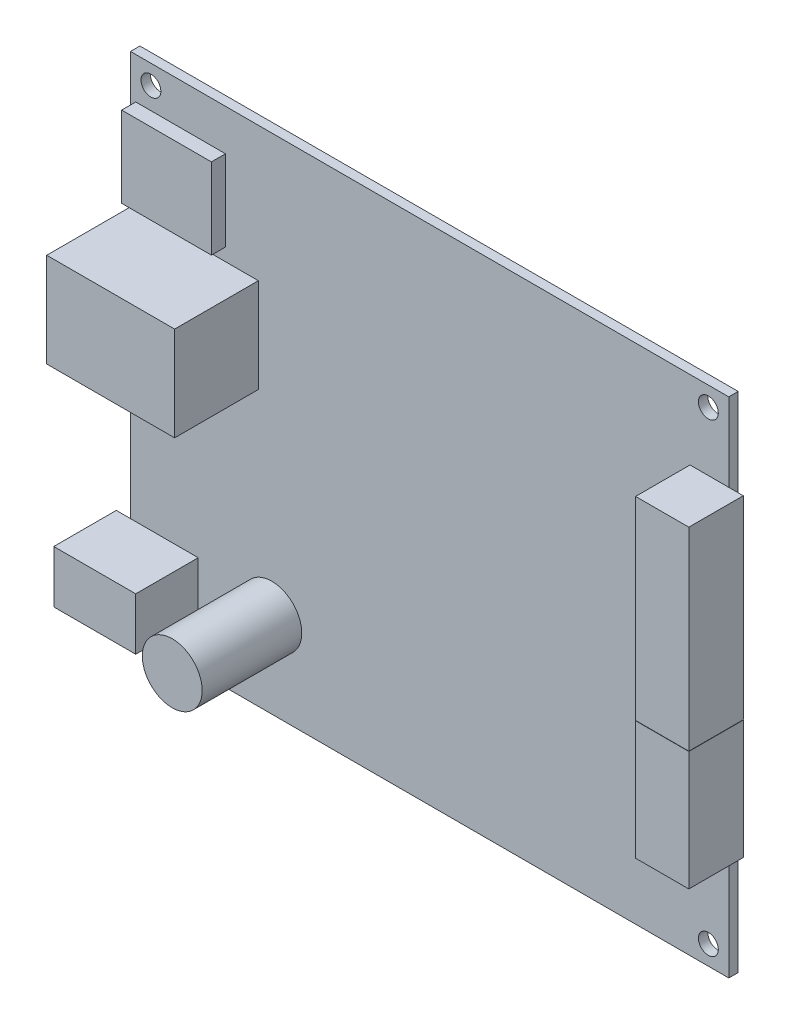
ISO-10303-21;
HEADER;
FILE_DESCRIPTION(('STEP AP214'),'2;1');
FILE_NAME('part.step','',(''),(''),'','','');
FILE_SCHEMA(('AUTOMOTIVE_DESIGN { 1 0 10303 214 1 1 1 1 }'));
ENDSEC;
DATA;
#1=APPLICATION_CONTEXT('core data for automotive mechanical design processes');
#2=APPLICATION_PROTOCOL_DEFINITION('international standard','automotive_design',2000,#1);
#3=PRODUCT_CONTEXT('',#1,'mechanical');
#4=PRODUCT('Part','Part','',(#3));
#5=PRODUCT_RELATED_PRODUCT_CATEGORY('part','',(#4));
#6=PRODUCT_DEFINITION_FORMATION('','',#4);
#7=PRODUCT_DEFINITION_CONTEXT('part definition',#1,'design');
#8=PRODUCT_DEFINITION('design','',#6,#7);
#9=PRODUCT_DEFINITION_SHAPE('','',#8);
#10=(LENGTH_UNIT() NAMED_UNIT(*) SI_UNIT(.MILLI.,.METRE.));
#11=(NAMED_UNIT(*) PLANE_ANGLE_UNIT() SI_UNIT($,.RADIAN.));
#12=(NAMED_UNIT(*) SI_UNIT($,.STERADIAN.) SOLID_ANGLE_UNIT());
#13=UNCERTAINTY_MEASURE_WITH_UNIT(LENGTH_MEASURE(1.E-05),#10,'distance_accuracy_value','');
#14=(GEOMETRIC_REPRESENTATION_CONTEXT(3) GLOBAL_UNCERTAINTY_ASSIGNED_CONTEXT((#13)) GLOBAL_UNIT_ASSIGNED_CONTEXT((#10,
#11,#12)) REPRESENTATION_CONTEXT('',''));
#15=CARTESIAN_POINT('',(0.,0.,0.));
#16=DIRECTION('',(0.,0.,1.));
#17=DIRECTION('',(1.,0.,0.));
#18=AXIS2_PLACEMENT_3D('',#15,#16,#17);
#19=CARTESIAN_POINT('',(0.,0.,1.6002));
#20=DIRECTION('',(0.,0.,-1.));
#21=DIRECTION('',(-1.,0.,0.));
#22=AXIS2_PLACEMENT_3D('',#19,#20,#21);
#23=PLANE('',#22);
#24=CARTESIAN_POINT('',(-47.3329,39.4462,1.6002));
#25=DIRECTION('',(0.,0.,-1.));
#26=DIRECTION('',(-1.,0.,0.));
#27=AXIS2_PLACEMENT_3D('',#24,#25,#26);
#28=CIRCLE('',#27,1.6891);
#29=CARTESIAN_POINT('',(-49.022,39.4462,1.6002));
#30=VERTEX_POINT('',#29);
#31=EDGE_CURVE('E775',#30,#30,#28,.F.);
#32=ORIENTED_EDGE('',*,*,#31,.F.);
#33=EDGE_LOOP('',(#32));
#34=FACE_BOUND('',#33,.T.);
#35=CARTESIAN_POINT('',(47.3329,39.4462,1.6002));
#36=DIRECTION('',(0.,0.,-1.));
#37=DIRECTION('',(-1.,0.,0.));
#38=AXIS2_PLACEMENT_3D('',#35,#36,#37);
#39=CIRCLE('',#38,1.6891);
#40=CARTESIAN_POINT('',(45.6438,39.4462,1.6002));
#41=VERTEX_POINT('',#40);
#42=EDGE_CURVE('E781',#41,#41,#39,.T.);
#43=ORIENTED_EDGE('',*,*,#42,.T.);
#44=EDGE_LOOP('',(#43));
#45=FACE_BOUND('',#44,.T.);
#46=DIRECTION('',(0.,-1.,0.));
#47=VECTOR('',#46,1.);
#48=CARTESIAN_POINT('',(-49.911,22.0345,1.6002));
#49=LINE('',#48,#47);
#50=CARTESIAN_POINT('',(-49.911,35.7505,1.6002));
#51=VERTEX_POINT('',#50);
#52=CARTESIAN_POINT('',(-49.911,22.0345,1.6002));
#53=VERTEX_POINT('',#52);
#54=EDGE_CURVE('E234',#51,#53,#49,.T.);
#55=ORIENTED_EDGE('',*,*,#54,.F.);
#56=DIRECTION('',(-1.,0.,0.));
#57=VECTOR('',#56,1.);
#58=CARTESIAN_POINT('',(-49.911,35.7505,1.6002));
#59=LINE('',#58,#57);
#60=CARTESIAN_POINT('',(-34.671,35.7505,1.6002));
#61=VERTEX_POINT('',#60);
#62=EDGE_CURVE('E231',#61,#51,#59,.T.);
#63=ORIENTED_EDGE('',*,*,#62,.F.);
#64=DIRECTION('',(0.,1.,0.));
#65=VECTOR('',#64,1.);
#66=CARTESIAN_POINT('',(-34.671,22.0345,1.6002));
#67=LINE('',#66,#65);
#68=CARTESIAN_POINT('',(-34.671,22.0345,1.6002));
#69=VERTEX_POINT('',#68);
#70=EDGE_CURVE('E55',#69,#61,#67,.T.);
#71=ORIENTED_EDGE('',*,*,#70,.F.);
#72=DIRECTION('',(1.,0.,0.));
#73=VECTOR('',#72,1.);
#74=CARTESIAN_POINT('',(-49.911,22.0345,1.6002));
#75=LINE('',#74,#73);
#76=EDGE_CURVE('E50',#53,#69,#75,.T.);
#77=ORIENTED_EDGE('',*,*,#76,.F.);
#78=EDGE_LOOP('',(#55,#63,#71,#77));
#79=FACE_BOUND('',#78,.T.);
#80=DIRECTION('',(-1.,0.,0.));
#81=VECTOR('',#80,1.);
#82=CARTESIAN_POINT('',(53.2638,-3.5687,1.6002));
#83=LINE('',#82,#81);
#84=CARTESIAN_POINT('',(50.8,-3.5687,1.6002));
#85=VERTEX_POINT('',#84);
#86=CARTESIAN_POINT('',(44.2214,-3.5687,1.6002));
#87=VERTEX_POINT('',#86);
#88=EDGE_CURVE('E238',#85,#87,#83,.T.);
#89=ORIENTED_EDGE('',*,*,#88,.F.);
#90=DIRECTION('',(0.,1.,0.));
#91=VECTOR('',#90,1.);
#92=CARTESIAN_POINT('',(50.8,-42.7355,1.6002));
#93=LINE('',#92,#91);
#94=CARTESIAN_POINT('',(50.8,-3.5179,1.6002));
#95=VERTEX_POINT('',#94);
#96=EDGE_CURVE('E522',#85,#95,#93,.T.);
#97=ORIENTED_EDGE('',*,*,#96,.T.);
#98=DIRECTION('',(1.,0.,0.));
#99=VECTOR('',#98,1.);
#100=CARTESIAN_POINT('',(53.2638,-3.5179,1.6002));
#101=LINE('',#100,#99);
#102=CARTESIAN_POINT('',(44.2214,-3.5179,1.6002));
#103=VERTEX_POINT('',#102);
#104=EDGE_CURVE('E280',#103,#95,#101,.T.);
#105=ORIENTED_EDGE('',*,*,#104,.F.);
#106=DIRECTION('',(0.,-1.,0.));
#107=VECTOR('',#106,1.);
#108=CARTESIAN_POINT('',(44.2214,29.4259,1.6002));
#109=LINE('',#108,#107);
#110=CARTESIAN_POINT('',(44.2214,29.4259,1.6002));
#111=VERTEX_POINT('',#110);
#112=EDGE_CURVE('E293',#111,#103,#109,.T.);
#113=ORIENTED_EDGE('',*,*,#112,.F.);
#114=DIRECTION('',(-1.,0.,0.));
#115=VECTOR('',#114,1.);
#116=CARTESIAN_POINT('',(53.2638,29.4259,1.6002));
#117=LINE('',#116,#115);
#118=CARTESIAN_POINT('',(50.8,29.4259,1.6002));
#119=VERTEX_POINT('',#118);
#120=EDGE_CURVE('E289',#119,#111,#117,.T.);
#121=ORIENTED_EDGE('',*,*,#120,.F.);
#122=CARTESIAN_POINT('',(50.8,42.7355,1.6002));
#123=VERTEX_POINT('',#122);
#124=EDGE_CURVE('E407',#119,#123,#93,.T.);
#125=ORIENTED_EDGE('',*,*,#124,.T.);
#126=DIRECTION('',(-1.,0.,0.));
#127=VECTOR('',#126,1.);
#128=CARTESIAN_POINT('',(-50.8,42.7355,1.6002));
#129=LINE('',#128,#127);
#130=CARTESIAN_POINT('',(-50.8,42.7355,1.6002));
#131=VERTEX_POINT('',#130);
#132=EDGE_CURVE('E382',#123,#131,#129,.T.);
#133=ORIENTED_EDGE('',*,*,#132,.T.);
#134=DIRECTION('',(0.,-1.,0.));
#135=VECTOR('',#134,1.);
#136=CARTESIAN_POINT('',(-50.8,-42.7355,1.6002));
#137=LINE('',#136,#135);
#138=CARTESIAN_POINT('',(-50.8,19.8755,1.6002));
#139=VERTEX_POINT('',#138);
#140=EDGE_CURVE('E392',#131,#139,#137,.T.);
#141=ORIENTED_EDGE('',*,*,#140,.T.);
#142=DIRECTION('',(-1.,0.,0.));
#143=VECTOR('',#142,1.);
#144=CARTESIAN_POINT('',(-50.8,19.8755,1.6002));
#145=LINE('',#144,#143);
#146=CARTESIAN_POINT('',(-29.083,19.8755,1.6002));
#147=VERTEX_POINT('',#146);
#148=EDGE_CURVE('E350',#147,#139,#145,.T.);
#149=ORIENTED_EDGE('',*,*,#148,.F.);
#150=DIRECTION('',(0.,1.,0.));
#151=VECTOR('',#150,1.);
#152=CARTESIAN_POINT('',(-29.083,3.8735,1.6002));
#153=LINE('',#152,#151);
#154=CARTESIAN_POINT('',(-29.083,3.8735,1.6002));
#155=VERTEX_POINT('',#154);
#156=EDGE_CURVE('E357',#155,#147,#153,.T.);
#157=ORIENTED_EDGE('',*,*,#156,.F.);
#158=DIRECTION('',(1.,0.,0.));
#159=VECTOR('',#158,1.);
#160=CARTESIAN_POINT('',(-50.8,3.8735,1.6002));
#161=LINE('',#160,#159);
#162=CARTESIAN_POINT('',(-50.8,3.8735,1.6002));
#163=VERTEX_POINT('',#162);
#164=EDGE_CURVE('E345',#163,#155,#161,.T.);
#165=ORIENTED_EDGE('',*,*,#164,.F.);
#166=CARTESIAN_POINT('',(-50.8,-25.9715,1.6002));
#167=VERTEX_POINT('',#166);
#168=EDGE_CURVE('E377',#163,#167,#137,.T.);
#169=ORIENTED_EDGE('',*,*,#168,.T.);
#170=DIRECTION('',(-1.,0.,0.));
#171=VECTOR('',#170,1.);
#172=CARTESIAN_POINT('',(-53.213,-25.9715,1.6002));
#173=LINE('',#172,#171);
#174=CARTESIAN_POINT('',(-39.2938,-25.9715,1.6002));
#175=VERTEX_POINT('',#174);
#176=EDGE_CURVE('E315',#175,#167,#173,.T.);
#177=ORIENTED_EDGE('',*,*,#176,.F.);
#178=DIRECTION('',(0.,1.,0.));
#179=VECTOR('',#178,1.);
#180=CARTESIAN_POINT('',(-39.2938,-34.8615,1.6002));
#181=LINE('',#180,#179);
#182=CARTESIAN_POINT('',(-39.2938,-34.8615,1.6002));
#183=VERTEX_POINT('',#182);
#184=EDGE_CURVE('E328',#183,#175,#181,.T.);
#185=ORIENTED_EDGE('',*,*,#184,.F.);
#186=DIRECTION('',(1.,0.,0.));
#187=VECTOR('',#186,1.);
#188=CARTESIAN_POINT('',(-53.213,-34.8615,1.6002));
#189=LINE('',#188,#187);
#190=CARTESIAN_POINT('',(-50.8,-34.8615,1.6002));
#191=VERTEX_POINT('',#190);
#192=EDGE_CURVE('E324',#191,#183,#189,.T.);
#193=ORIENTED_EDGE('',*,*,#192,.F.);
#194=CARTESIAN_POINT('',(-50.8,-42.7355,1.6002));
#195=VERTEX_POINT('',#194);
#196=EDGE_CURVE('E378',#191,#195,#137,.T.);
#197=ORIENTED_EDGE('',*,*,#196,.T.);
#198=DIRECTION('',(1.,0.,0.));
#199=VECTOR('',#198,1.);
#200=CARTESIAN_POINT('',(-50.8,-42.7355,1.6002));
#201=LINE('',#200,#199);
#202=CARTESIAN_POINT('',(50.8,-42.7355,1.6002));
#203=VERTEX_POINT('',#202);
#204=EDGE_CURVE('E384',#195,#203,#201,.T.);
#205=ORIENTED_EDGE('',*,*,#204,.T.);
#206=CARTESIAN_POINT('',(50.8,-23.7871,1.6002));
#207=VERTEX_POINT('',#206);
#208=EDGE_CURVE('E518',#203,#207,#93,.T.);
#209=ORIENTED_EDGE('',*,*,#208,.T.);
#210=DIRECTION('',(1.,0.,0.));
#211=VECTOR('',#210,1.);
#212=CARTESIAN_POINT('',(53.2638,-23.7871,1.6002));
#213=LINE('',#212,#211);
#214=CARTESIAN_POINT('',(44.2214,-23.7871,1.6002));
#215=VERTEX_POINT('',#214);
#216=EDGE_CURVE('E248',#215,#207,#213,.T.);
#217=ORIENTED_EDGE('',*,*,#216,.F.);
#218=DIRECTION('',(0.,-1.,0.));
#219=VECTOR('',#218,1.);
#220=CARTESIAN_POINT('',(44.2214,-3.5687,1.6002));
#221=LINE('',#220,#219);
#222=EDGE_CURVE('E258',#87,#215,#221,.T.);
#223=ORIENTED_EDGE('',*,*,#222,.F.);
#224=EDGE_LOOP('',(#89,#97,#105,#113,#121,#125,#133,#141,#149,#157,#165,#169,#177,#185,#193,
#197,#205,#209,#217,#223));
#225=FACE_BOUND('',#224,.T.);
#226=CARTESIAN_POINT('',(-26.797,-28.2575,1.6002));
#227=DIRECTION('',(0.,0.,-1.));
#228=DIRECTION('',(-1.,0.,0.));
#229=AXIS2_PLACEMENT_3D('',#226,#227,#228);
#230=CIRCLE('',#229,5.08);
#231=CARTESIAN_POINT('',(-31.877,-28.2575,1.6002));
#232=VERTEX_POINT('',#231);
#233=EDGE_CURVE('E11',#232,#232,#230,.F.);
#234=ORIENTED_EDGE('',*,*,#233,.F.);
#235=EDGE_LOOP('',(#234));
#236=FACE_BOUND('',#235,.T.);
#237=CARTESIAN_POINT('',(-47.3329,-39.4462,1.6002));
#238=DIRECTION('',(0.,0.,-1.));
#239=DIRECTION('',(-1.,0.,0.));
#240=AXIS2_PLACEMENT_3D('',#237,#238,#239);
#241=CIRCLE('',#240,1.6891);
#242=CARTESIAN_POINT('',(-49.022,-39.4462,1.6002));
#243=VERTEX_POINT('',#242);
#244=EDGE_CURVE('E766',#243,#243,#241,.T.);
#245=ORIENTED_EDGE('',*,*,#244,.T.);
#246=EDGE_LOOP('',(#245));
#247=FACE_BOUND('',#246,.T.);
#248=CARTESIAN_POINT('',(47.3329,-39.4462,1.6002));
#249=DIRECTION('',(0.,0.,-1.));
#250=DIRECTION('',(-1.,0.,0.));
#251=AXIS2_PLACEMENT_3D('',#248,#249,#250);
#252=CIRCLE('',#251,1.6891);
#253=CARTESIAN_POINT('',(45.6438,-39.4462,1.6002));
#254=VERTEX_POINT('',#253);
#255=EDGE_CURVE('E761',#254,#254,#252,.F.);
#256=ORIENTED_EDGE('',*,*,#255,.F.);
#257=EDGE_LOOP('',(#256));
#258=FACE_BOUND('',#257,.T.);
#259=ADVANCED_FACE('F35',(#34,#45,#79,#225,#236,#247,#258),#23,.F.);
#260=CARTESIAN_POINT('',(0.,0.,0.));
#261=DIRECTION('',(0.,0.,-1.));
#262=DIRECTION('',(-1.,0.,0.));
#263=AXIS2_PLACEMENT_3D('',#260,#261,#262);
#264=PLANE('',#263);
#265=CARTESIAN_POINT('',(-47.3329,39.4462,0.));
#266=DIRECTION('',(0.,0.,1.));
#267=DIRECTION('',(1.,0.,0.));
#268=AXIS2_PLACEMENT_3D('',#265,#266,#267);
#269=CIRCLE('',#268,1.6891);
#270=CARTESIAN_POINT('',(-45.6438,39.4462,0.));
#271=VERTEX_POINT('',#270);
#272=EDGE_CURVE('E772',#271,#271,#269,.T.);
#273=ORIENTED_EDGE('',*,*,#272,.T.);
#274=EDGE_LOOP('',(#273));
#275=FACE_BOUND('',#274,.T.);
#276=CARTESIAN_POINT('',(47.3329,39.4462,0.));
#277=DIRECTION('',(0.,0.,-1.));
#278=DIRECTION('',(-1.,0.,0.));
#279=AXIS2_PLACEMENT_3D('',#276,#277,#278);
#280=CIRCLE('',#279,1.6891);
#281=CARTESIAN_POINT('',(45.6438,39.4462,0.));
#282=VERTEX_POINT('',#281);
#283=EDGE_CURVE('E778',#282,#282,#280,.T.);
#284=ORIENTED_EDGE('',*,*,#283,.F.);
#285=EDGE_LOOP('',(#284));
#286=FACE_BOUND('',#285,.T.);
#287=DIRECTION('',(0.,1.,0.));
#288=VECTOR('',#287,1.);
#289=CARTESIAN_POINT('',(50.8,-42.7355,0.));
#290=LINE('',#289,#288);
#291=CARTESIAN_POINT('',(50.8,-42.7355,0.));
#292=VERTEX_POINT('',#291);
#293=CARTESIAN_POINT('',(50.8,42.7355,0.));
#294=VERTEX_POINT('',#293);
#295=EDGE_CURVE('E411',#292,#294,#290,.T.);
#296=ORIENTED_EDGE('',*,*,#295,.F.);
#297=DIRECTION('',(1.,0.,0.));
#298=VECTOR('',#297,1.);
#299=CARTESIAN_POINT('',(-50.8,-42.7355,0.));
#300=LINE('',#299,#298);
#301=CARTESIAN_POINT('',(-50.8,-42.7355,0.));
#302=VERTEX_POINT('',#301);
#303=EDGE_CURVE('E405',#302,#292,#300,.T.);
#304=ORIENTED_EDGE('',*,*,#303,.F.);
#305=DIRECTION('',(0.,-1.,0.));
#306=VECTOR('',#305,1.);
#307=CARTESIAN_POINT('',(-50.8,-42.7355,0.));
#308=LINE('',#307,#306);
#309=CARTESIAN_POINT('',(-50.8,42.7355,0.));
#310=VERTEX_POINT('',#309);
#311=EDGE_CURVE('E408',#310,#302,#308,.T.);
#312=ORIENTED_EDGE('',*,*,#311,.F.);
#313=DIRECTION('',(-1.,0.,0.));
#314=VECTOR('',#313,1.);
#315=CARTESIAN_POINT('',(-50.8,42.7355,0.));
#316=LINE('',#315,#314);
#317=EDGE_CURVE('E410',#294,#310,#316,.T.);
#318=ORIENTED_EDGE('',*,*,#317,.F.);
#319=EDGE_LOOP('',(#296,#304,#312,#318));
#320=FACE_BOUND('',#319,.T.);
#321=CARTESIAN_POINT('',(-47.3329,-39.4462,0.));
#322=DIRECTION('',(0.,0.,-1.));
#323=DIRECTION('',(1.,0.,0.));
#324=AXIS2_PLACEMENT_3D('',#321,#322,#323);
#325=CIRCLE('',#324,1.6891);
#326=CARTESIAN_POINT('',(-45.6438,-39.4462,0.));
#327=VERTEX_POINT('',#326);
#328=EDGE_CURVE('E763',#327,#327,#325,.T.);
#329=ORIENTED_EDGE('',*,*,#328,.F.);
#330=EDGE_LOOP('',(#329));
#331=FACE_BOUND('',#330,.T.);
#332=CARTESIAN_POINT('',(47.3329,-39.4462,0.));
#333=DIRECTION('',(0.,0.,1.));
#334=DIRECTION('',(-1.,0.,0.));
#335=AXIS2_PLACEMENT_3D('',#332,#333,#334);
#336=CIRCLE('',#335,1.6891);
#337=CARTESIAN_POINT('',(45.6438,-39.4462,0.));
#338=VERTEX_POINT('',#337);
#339=EDGE_CURVE('E758',#338,#338,#336,.T.);
#340=ORIENTED_EDGE('',*,*,#339,.T.);
#341=EDGE_LOOP('',(#340));
#342=FACE_BOUND('',#341,.T.);
#343=ADVANCED_FACE('F481',(#275,#286,#320,#331,#342),#264,.T.);
#344=CARTESIAN_POINT('',(50.8,-42.7355,1.6002));
#345=DIRECTION('',(-1.,0.,0.));
#346=DIRECTION('',(0.,0.,1.));
#347=AXIS2_PLACEMENT_3D('',#344,#345,#346);
#348=PLANE('',#347);
#349=ORIENTED_EDGE('',*,*,#295,.T.);
#350=DIRECTION('',(0.,0.,-1.));
#351=VECTOR('',#350,1.);
#352=CARTESIAN_POINT('',(50.8,42.7355,1.6002));
#353=LINE('',#352,#351);
#354=EDGE_CURVE('E43',#123,#294,#353,.T.);
#355=ORIENTED_EDGE('',*,*,#354,.F.);
#356=ORIENTED_EDGE('',*,*,#124,.F.);
#357=EDGE_CURVE('E523',#95,#119,#93,.T.);
#358=ORIENTED_EDGE('',*,*,#357,.F.);
#359=ORIENTED_EDGE('',*,*,#96,.F.);
#360=EDGE_CURVE('E520',#207,#85,#93,.T.);
#361=ORIENTED_EDGE('',*,*,#360,.F.);
#362=ORIENTED_EDGE('',*,*,#208,.F.);
#363=DIRECTION('',(0.,0.,-1.));
#364=VECTOR('',#363,1.);
#365=CARTESIAN_POINT('',(50.8,-42.7355,1.6002));
#366=LINE('',#365,#364);
#367=EDGE_CURVE('E402',#203,#292,#366,.T.);
#368=ORIENTED_EDGE('',*,*,#367,.T.);
#369=EDGE_LOOP('',(#349,#355,#356,#358,#359,#361,#362,#368));
#370=FACE_BOUND('',#369,.T.);
#371=ADVANCED_FACE('F37',(#370),#348,.F.);
#372=CARTESIAN_POINT('',(-50.8,42.7355,1.6002));
#373=DIRECTION('',(0.,-1.,0.));
#374=DIRECTION('',(0.,0.,-1.));
#375=AXIS2_PLACEMENT_3D('',#372,#373,#374);
#376=PLANE('',#375);
#377=ORIENTED_EDGE('',*,*,#317,.T.);
#378=DIRECTION('',(0.,0.,-1.));
#379=VECTOR('',#378,1.);
#380=CARTESIAN_POINT('',(-50.8,42.7355,1.6002));
#381=LINE('',#380,#379);
#382=EDGE_CURVE('E396',#131,#310,#381,.T.);
#383=ORIENTED_EDGE('',*,*,#382,.F.);
#384=ORIENTED_EDGE('',*,*,#132,.F.);
#385=ORIENTED_EDGE('',*,*,#354,.T.);
#386=EDGE_LOOP('',(#377,#383,#384,#385));
#387=FACE_BOUND('',#386,.T.);
#388=ADVANCED_FACE('F500',(#387),#376,.F.);
#389=CARTESIAN_POINT('',(-50.8,-42.7355,1.6002));
#390=DIRECTION('',(1.,0.,0.));
#391=DIRECTION('',(0.,0.,-1.));
#392=AXIS2_PLACEMENT_3D('',#389,#390,#391);
#393=PLANE('',#392);
#394=ORIENTED_EDGE('',*,*,#311,.T.);
#395=DIRECTION('',(0.,0.,-1.));
#396=VECTOR('',#395,1.);
#397=CARTESIAN_POINT('',(-50.8,-42.7355,1.6002));
#398=LINE('',#397,#396);
#399=EDGE_CURVE('E399',#195,#302,#398,.T.);
#400=ORIENTED_EDGE('',*,*,#399,.F.);
#401=ORIENTED_EDGE('',*,*,#196,.F.);
#402=EDGE_CURVE('E374',#167,#191,#137,.T.);
#403=ORIENTED_EDGE('',*,*,#402,.F.);
#404=ORIENTED_EDGE('',*,*,#168,.F.);
#405=DIRECTION('',(0.,0.,-1.));
#406=VECTOR('',#405,1.);
#407=CARTESIAN_POINT('',(-50.8,3.8735,15.8242));
#408=LINE('',#407,#406);
#409=CARTESIAN_POINT('',(-50.8,3.8735,15.8242));
#410=VERTEX_POINT('',#409);
#411=EDGE_CURVE('E413',#410,#163,#408,.T.);
#412=ORIENTED_EDGE('',*,*,#411,.F.);
#413=DIRECTION('',(0.,-1.,0.));
#414=VECTOR('',#413,1.);
#415=CARTESIAN_POINT('',(-50.8,3.8735,15.8242));
#416=LINE('',#415,#414);
#417=CARTESIAN_POINT('',(-50.8,19.8755,15.8242));
#418=VERTEX_POINT('',#417);
#419=EDGE_CURVE('E346',#418,#410,#416,.T.);
#420=ORIENTED_EDGE('',*,*,#419,.F.);
#421=DIRECTION('',(0.,0.,-1.));
#422=VECTOR('',#421,1.);
#423=CARTESIAN_POINT('',(-50.8,19.8755,15.8242));
#424=LINE('',#423,#422);
#425=EDGE_CURVE('E356',#418,#139,#424,.T.);
#426=ORIENTED_EDGE('',*,*,#425,.T.);
#427=ORIENTED_EDGE('',*,*,#140,.F.);
#428=ORIENTED_EDGE('',*,*,#382,.T.);
#429=EDGE_LOOP('',(#394,#400,#401,#403,#404,#412,#420,#426,#427,#428));
#430=FACE_BOUND('',#429,.T.);
#431=ADVANCED_FACE('F441',(#430),#393,.F.);
#432=CARTESIAN_POINT('',(-50.8,-42.7355,1.6002));
#433=DIRECTION('',(0.,1.,0.));
#434=DIRECTION('',(0.,0.,1.));
#435=AXIS2_PLACEMENT_3D('',#432,#433,#434);
#436=PLANE('',#435);
#437=ORIENTED_EDGE('',*,*,#303,.T.);
#438=ORIENTED_EDGE('',*,*,#367,.F.);
#439=ORIENTED_EDGE('',*,*,#204,.F.);
#440=ORIENTED_EDGE('',*,*,#399,.T.);
#441=EDGE_LOOP('',(#437,#438,#439,#440));
#442=FACE_BOUND('',#441,.T.);
#443=ADVANCED_FACE('F495',(#442),#436,.F.);
#444=CARTESIAN_POINT('',(-50.8,3.8735,15.8242));
#445=DIRECTION('',(0.,1.,0.));
#446=DIRECTION('',(-1.,0.,0.));
#447=AXIS2_PLACEMENT_3D('',#444,#445,#446);
#448=PLANE('',#447);
#449=ORIENTED_EDGE('',*,*,#164,.T.);
#450=DIRECTION('',(0.,0.,-1.));
#451=VECTOR('',#450,1.);
#452=CARTESIAN_POINT('',(-29.083,3.8735,15.8242));
#453=LINE('',#452,#451);
#454=CARTESIAN_POINT('',(-29.083,3.8735,15.8242));
#455=VERTEX_POINT('',#454);
#456=EDGE_CURVE('E418',#455,#155,#453,.T.);
#457=ORIENTED_EDGE('',*,*,#456,.F.);
#458=DIRECTION('',(1.,0.,0.));
#459=VECTOR('',#458,1.);
#460=CARTESIAN_POINT('',(-50.8,3.8735,15.8242));
#461=LINE('',#460,#459);
#462=EDGE_CURVE('E349',#410,#455,#461,.T.);
#463=ORIENTED_EDGE('',*,*,#462,.F.);
#464=ORIENTED_EDGE('',*,*,#411,.T.);
#465=EDGE_LOOP('',(#449,#457,#463,#464));
#466=FACE_BOUND('',#465,.T.);
#467=ADVANCED_FACE('F426',(#466),#448,.F.);
#468=CARTESIAN_POINT('',(-29.083,3.8735,15.8242));
#469=DIRECTION('',(-1.,0.,0.));
#470=DIRECTION('',(0.,0.,1.));
#471=AXIS2_PLACEMENT_3D('',#468,#469,#470);
#472=PLANE('',#471);
#473=ORIENTED_EDGE('',*,*,#156,.T.);
#474=DIRECTION('',(0.,0.,-1.));
#475=VECTOR('',#474,1.);
#476=CARTESIAN_POINT('',(-29.083,19.8755,15.8242));
#477=LINE('',#476,#475);
#478=CARTESIAN_POINT('',(-29.083,19.8755,15.8242));
#479=VERTEX_POINT('',#478);
#480=EDGE_CURVE('E362',#479,#147,#477,.T.);
#481=ORIENTED_EDGE('',*,*,#480,.F.);
#482=DIRECTION('',(0.,1.,0.));
#483=VECTOR('',#482,1.);
#484=CARTESIAN_POINT('',(-29.083,3.8735,15.8242));
#485=LINE('',#484,#483);
#486=EDGE_CURVE('E352',#455,#479,#485,.T.);
#487=ORIENTED_EDGE('',*,*,#486,.F.);
#488=ORIENTED_EDGE('',*,*,#456,.T.);
#489=EDGE_LOOP('',(#473,#481,#487,#488));
#490=FACE_BOUND('',#489,.T.);
#491=ADVANCED_FACE('F432',(#490),#472,.F.);
#492=CARTESIAN_POINT('',(-50.8,19.8755,15.8242));
#493=DIRECTION('',(0.,-1.,0.));
#494=DIRECTION('',(0.,0.,-1.));
#495=AXIS2_PLACEMENT_3D('',#492,#493,#494);
#496=PLANE('',#495);
#497=ORIENTED_EDGE('',*,*,#148,.T.);
#498=ORIENTED_EDGE('',*,*,#425,.F.);
#499=DIRECTION('',(-1.,0.,0.));
#500=VECTOR('',#499,1.);
#501=CARTESIAN_POINT('',(-50.8,19.8755,15.8242));
#502=LINE('',#501,#500);
#503=EDGE_CURVE('E354',#479,#418,#502,.T.);
#504=ORIENTED_EDGE('',*,*,#503,.F.);
#505=ORIENTED_EDGE('',*,*,#480,.T.);
#506=EDGE_LOOP('',(#497,#498,#504,#505));
#507=FACE_BOUND('',#506,.T.);
#508=ADVANCED_FACE('F875',(#507),#496,.F.);
#509=CARTESIAN_POINT('',(0.,0.,15.8242));
#510=DIRECTION('',(0.,0.,-1.));
#511=DIRECTION('',(-1.,0.,0.));
#512=AXIS2_PLACEMENT_3D('',#509,#510,#511);
#513=PLANE('',#512);
#514=ORIENTED_EDGE('',*,*,#419,.T.);
#515=ORIENTED_EDGE('',*,*,#462,.T.);
#516=ORIENTED_EDGE('',*,*,#486,.T.);
#517=ORIENTED_EDGE('',*,*,#503,.T.);
#518=EDGE_LOOP('',(#514,#515,#516,#517));
#519=FACE_BOUND('',#518,.T.);
#520=ADVANCED_FACE('F437',(#519),#513,.F.);
#521=CARTESIAN_POINT('',(0.,0.,1.6002));
#522=DIRECTION('',(0.,0.,-1.));
#523=DIRECTION('',(-1.,0.,0.));
#524=AXIS2_PLACEMENT_3D('',#521,#522,#523);
#525=PLANE('',#524);
#526=ORIENTED_EDGE('',*,*,#402,.T.);
#527=CARTESIAN_POINT('',(-53.213,-34.8615,1.6002));
#528=VERTEX_POINT('',#527);
#529=EDGE_CURVE('E325',#528,#191,#189,.T.);
#530=ORIENTED_EDGE('',*,*,#529,.F.);
#531=DIRECTION('',(0.,-1.,0.));
#532=VECTOR('',#531,1.);
#533=CARTESIAN_POINT('',(-53.213,-34.8615,1.6002));
#534=LINE('',#533,#532);
#535=CARTESIAN_POINT('',(-53.213,-25.9715,1.6002));
#536=VERTEX_POINT('',#535);
#537=EDGE_CURVE('E310',#536,#528,#534,.T.);
#538=ORIENTED_EDGE('',*,*,#537,.F.);
#539=EDGE_CURVE('E331',#167,#536,#173,.T.);
#540=ORIENTED_EDGE('',*,*,#539,.F.);
#541=EDGE_LOOP('',(#526,#530,#538,#540));
#542=FACE_BOUND('',#541,.T.);
#543=ADVANCED_FACE('F447',(#542),#525,.T.);
#544=CARTESIAN_POINT('',(-53.213,-34.8615,12.2174));
#545=DIRECTION('',(1.,0.,0.));
#546=DIRECTION('',(0.,0.,-1.));
#547=AXIS2_PLACEMENT_3D('',#544,#545,#546);
#548=PLANE('',#547);
#549=ORIENTED_EDGE('',*,*,#537,.T.);
#550=DIRECTION('',(0.,0.,-1.));
#551=VECTOR('',#550,1.);
#552=CARTESIAN_POINT('',(-53.213,-34.8615,12.2174));
#553=LINE('',#552,#551);
#554=CARTESIAN_POINT('',(-53.213,-34.8615,12.2174));
#555=VERTEX_POINT('',#554);
#556=EDGE_CURVE('E342',#555,#528,#553,.T.);
#557=ORIENTED_EDGE('',*,*,#556,.F.);
#558=DIRECTION('',(0.,-1.,0.));
#559=VECTOR('',#558,1.);
#560=CARTESIAN_POINT('',(-53.213,-34.8615,12.2174));
#561=LINE('',#560,#559);
#562=CARTESIAN_POINT('',(-53.213,-25.9715,12.2174));
#563=VERTEX_POINT('',#562);
#564=EDGE_CURVE('E311',#563,#555,#561,.T.);
#565=ORIENTED_EDGE('',*,*,#564,.F.);
#566=DIRECTION('',(0.,0.,-1.));
#567=VECTOR('',#566,1.);
#568=CARTESIAN_POINT('',(-53.213,-25.9715,12.2174));
#569=LINE('',#568,#567);
#570=EDGE_CURVE('E321',#563,#536,#569,.T.);
#571=ORIENTED_EDGE('',*,*,#570,.T.);
#572=EDGE_LOOP('',(#549,#557,#565,#571));
#573=FACE_BOUND('',#572,.T.);
#574=ADVANCED_FACE('F464',(#573),#548,.F.);
#575=CARTESIAN_POINT('',(-53.213,-34.8615,12.2174));
#576=DIRECTION('',(0.,1.,0.));
#577=DIRECTION('',(0.,0.,1.));
#578=AXIS2_PLACEMENT_3D('',#575,#576,#577);
#579=PLANE('',#578);
#580=ORIENTED_EDGE('',*,*,#529,.T.);
#581=ORIENTED_EDGE('',*,*,#192,.T.);
#582=DIRECTION('',(0.,0.,-1.));
#583=VECTOR('',#582,1.);
#584=CARTESIAN_POINT('',(-39.2938,-34.8615,12.2174));
#585=LINE('',#584,#583);
#586=CARTESIAN_POINT('',(-39.2938,-34.8615,12.2174));
#587=VERTEX_POINT('',#586);
#588=EDGE_CURVE('E339',#587,#183,#585,.T.);
#589=ORIENTED_EDGE('',*,*,#588,.F.);
#590=DIRECTION('',(1.,0.,0.));
#591=VECTOR('',#590,1.);
#592=CARTESIAN_POINT('',(-53.213,-34.8615,12.2174));
#593=LINE('',#592,#591);
#594=EDGE_CURVE('E314',#555,#587,#593,.T.);
#595=ORIENTED_EDGE('',*,*,#594,.F.);
#596=ORIENTED_EDGE('',*,*,#556,.T.);
#597=EDGE_LOOP('',(#580,#581,#589,#595,#596));
#598=FACE_BOUND('',#597,.T.);
#599=ADVANCED_FACE('F460',(#598),#579,.F.);
#600=CARTESIAN_POINT('',(-39.2938,-34.8615,12.2174));
#601=DIRECTION('',(-1.,0.,0.));
#602=DIRECTION('',(0.,-1.,0.));
#603=AXIS2_PLACEMENT_3D('',#600,#601,#602);
#604=PLANE('',#603);
#605=ORIENTED_EDGE('',*,*,#184,.T.);
#606=DIRECTION('',(0.,0.,-1.));
#607=VECTOR('',#606,1.);
#608=CARTESIAN_POINT('',(-39.2938,-25.9715,12.2174));
#609=LINE('',#608,#607);
#610=CARTESIAN_POINT('',(-39.2938,-25.9715,12.2174));
#611=VERTEX_POINT('',#610);
#612=EDGE_CURVE('E336',#611,#175,#609,.T.);
#613=ORIENTED_EDGE('',*,*,#612,.F.);
#614=DIRECTION('',(0.,1.,0.));
#615=VECTOR('',#614,1.);
#616=CARTESIAN_POINT('',(-39.2938,-34.8615,12.2174));
#617=LINE('',#616,#615);
#618=EDGE_CURVE('E317',#587,#611,#617,.T.);
#619=ORIENTED_EDGE('',*,*,#618,.F.);
#620=ORIENTED_EDGE('',*,*,#588,.T.);
#621=EDGE_LOOP('',(#605,#613,#619,#620));
#622=FACE_BOUND('',#621,.T.);
#623=ADVANCED_FACE('F455',(#622),#604,.F.);
#624=CARTESIAN_POINT('',(-53.213,-25.9715,12.2174));
#625=DIRECTION('',(0.,-1.,0.));
#626=DIRECTION('',(0.,0.,-1.));
#627=AXIS2_PLACEMENT_3D('',#624,#625,#626);
#628=PLANE('',#627);
#629=ORIENTED_EDGE('',*,*,#176,.T.);
#630=ORIENTED_EDGE('',*,*,#539,.T.);
#631=ORIENTED_EDGE('',*,*,#570,.F.);
#632=DIRECTION('',(-1.,0.,0.));
#633=VECTOR('',#632,1.);
#634=CARTESIAN_POINT('',(-53.213,-25.9715,12.2174));
#635=LINE('',#634,#633);
#636=EDGE_CURVE('E319',#611,#563,#635,.T.);
#637=ORIENTED_EDGE('',*,*,#636,.F.);
#638=ORIENTED_EDGE('',*,*,#612,.T.);
#639=EDGE_LOOP('',(#629,#630,#631,#637,#638));
#640=FACE_BOUND('',#639,.T.);
#641=ADVANCED_FACE('F450',(#640),#628,.F.);
#642=CARTESIAN_POINT('',(0.,0.,12.2174));
#643=DIRECTION('',(0.,0.,-1.));
#644=DIRECTION('',(-1.,0.,0.));
#645=AXIS2_PLACEMENT_3D('',#642,#643,#644);
#646=PLANE('',#645);
#647=ORIENTED_EDGE('',*,*,#564,.T.);
#648=ORIENTED_EDGE('',*,*,#594,.T.);
#649=ORIENTED_EDGE('',*,*,#618,.T.);
#650=ORIENTED_EDGE('',*,*,#636,.T.);
#651=EDGE_LOOP('',(#647,#648,#649,#650));
#652=FACE_BOUND('',#651,.T.);
#653=ADVANCED_FACE('F466',(#652),#646,.F.);
#654=CARTESIAN_POINT('',(0.,0.,1.6002));
#655=DIRECTION('',(0.,0.,-1.));
#656=DIRECTION('',(-1.,0.,0.));
#657=AXIS2_PLACEMENT_3D('',#654,#655,#656);
#658=PLANE('',#657);
#659=ORIENTED_EDGE('',*,*,#357,.T.);
#660=CARTESIAN_POINT('',(53.2638,29.4259,1.6002));
#661=VERTEX_POINT('',#660);
#662=EDGE_CURVE('E290',#661,#119,#117,.T.);
#663=ORIENTED_EDGE('',*,*,#662,.F.);
#664=DIRECTION('',(0.,1.,0.));
#665=VECTOR('',#664,1.);
#666=CARTESIAN_POINT('',(53.2638,29.4259,1.6002));
#667=LINE('',#666,#665);
#668=CARTESIAN_POINT('',(53.2638,-3.5179,1.6002));
#669=VERTEX_POINT('',#668);
#670=EDGE_CURVE('E275',#669,#661,#667,.T.);
#671=ORIENTED_EDGE('',*,*,#670,.F.);
#672=EDGE_CURVE('E296',#95,#669,#101,.T.);
#673=ORIENTED_EDGE('',*,*,#672,.F.);
#674=EDGE_LOOP('',(#659,#663,#671,#673));
#675=FACE_BOUND('',#674,.T.);
#676=ADVANCED_FACE('F468',(#675),#658,.T.);
#677=CARTESIAN_POINT('',(53.2638,29.4259,10.8458));
#678=DIRECTION('',(-1.,0.,0.));
#679=DIRECTION('',(0.,0.,1.));
#680=AXIS2_PLACEMENT_3D('',#677,#678,#679);
#681=PLANE('',#680);
#682=ORIENTED_EDGE('',*,*,#670,.T.);
#683=DIRECTION('',(0.,0.,-1.));
#684=VECTOR('',#683,1.);
#685=CARTESIAN_POINT('',(53.2638,29.4259,10.8458));
#686=LINE('',#685,#684);
#687=CARTESIAN_POINT('',(53.2638,29.4259,10.8458));
#688=VERTEX_POINT('',#687);
#689=EDGE_CURVE('E307',#688,#661,#686,.T.);
#690=ORIENTED_EDGE('',*,*,#689,.F.);
#691=DIRECTION('',(0.,1.,0.));
#692=VECTOR('',#691,1.);
#693=CARTESIAN_POINT('',(53.2638,29.4259,10.8458));
#694=LINE('',#693,#692);
#695=CARTESIAN_POINT('',(53.2638,-3.5179,10.8458));
#696=VERTEX_POINT('',#695);
#697=EDGE_CURVE('E276',#696,#688,#694,.T.);
#698=ORIENTED_EDGE('',*,*,#697,.F.);
#699=DIRECTION('',(0.,0.,-1.));
#700=VECTOR('',#699,1.);
#701=CARTESIAN_POINT('',(53.2638,-3.5179,10.8458));
#702=LINE('',#701,#700);
#703=EDGE_CURVE('E286',#696,#669,#702,.T.);
#704=ORIENTED_EDGE('',*,*,#703,.T.);
#705=EDGE_LOOP('',(#682,#690,#698,#704));
#706=FACE_BOUND('',#705,.T.);
#707=ADVANCED_FACE('F474',(#706),#681,.F.);
#708=CARTESIAN_POINT('',(53.2638,29.4259,10.8458));
#709=DIRECTION('',(0.,-1.,0.));
#710=DIRECTION('',(1.,0.,0.));
#711=AXIS2_PLACEMENT_3D('',#708,#709,#710);
#712=PLANE('',#711);
#713=ORIENTED_EDGE('',*,*,#662,.T.);
#714=ORIENTED_EDGE('',*,*,#120,.T.);
#715=DIRECTION('',(0.,0.,-1.));
#716=VECTOR('',#715,1.);
#717=CARTESIAN_POINT('',(44.2214,29.4259,10.8458));
#718=LINE('',#717,#716);
#719=CARTESIAN_POINT('',(44.2214,29.4259,10.8458));
#720=VERTEX_POINT('',#719);
#721=EDGE_CURVE('E304',#720,#111,#718,.T.);
#722=ORIENTED_EDGE('',*,*,#721,.F.);
#723=DIRECTION('',(-1.,0.,0.));
#724=VECTOR('',#723,1.);
#725=CARTESIAN_POINT('',(53.2638,29.4259,10.8458));
#726=LINE('',#725,#724);
#727=EDGE_CURVE('E279',#688,#720,#726,.T.);
#728=ORIENTED_EDGE('',*,*,#727,.F.);
#729=ORIENTED_EDGE('',*,*,#689,.T.);
#730=EDGE_LOOP('',(#713,#714,#722,#728,#729));
#731=FACE_BOUND('',#730,.T.);
#732=ADVANCED_FACE('F540',(#731),#712,.F.);
#733=CARTESIAN_POINT('',(44.2214,29.4259,10.8458));
#734=DIRECTION('',(1.,0.,0.));
#735=DIRECTION('',(0.,1.,0.));
#736=AXIS2_PLACEMENT_3D('',#733,#734,#735);
#737=PLANE('',#736);
#738=ORIENTED_EDGE('',*,*,#112,.T.);
#739=DIRECTION('',(0.,0.,-1.));
#740=VECTOR('',#739,1.);
#741=CARTESIAN_POINT('',(44.2214,-3.5179,10.8458));
#742=LINE('',#741,#740);
#743=CARTESIAN_POINT('',(44.2214,-3.5179,10.8458));
#744=VERTEX_POINT('',#743);
#745=EDGE_CURVE('E301',#744,#103,#742,.T.);
#746=ORIENTED_EDGE('',*,*,#745,.F.);
#747=DIRECTION('',(0.,-1.,0.));
#748=VECTOR('',#747,1.);
#749=CARTESIAN_POINT('',(44.2214,29.4259,10.8458));
#750=LINE('',#749,#748);
#751=EDGE_CURVE('E282',#720,#744,#750,.T.);
#752=ORIENTED_EDGE('',*,*,#751,.F.);
#753=ORIENTED_EDGE('',*,*,#721,.T.);
#754=EDGE_LOOP('',(#738,#746,#752,#753));
#755=FACE_BOUND('',#754,.T.);
#756=ADVANCED_FACE('F536',(#755),#737,.F.);
#757=CARTESIAN_POINT('',(53.2638,-3.5179,10.8458));
#758=DIRECTION('',(0.,1.,0.));
#759=DIRECTION('',(0.,0.,1.));
#760=AXIS2_PLACEMENT_3D('',#757,#758,#759);
#761=PLANE('',#760);
#762=ORIENTED_EDGE('',*,*,#104,.T.);
#763=ORIENTED_EDGE('',*,*,#672,.T.);
#764=ORIENTED_EDGE('',*,*,#703,.F.);
#765=DIRECTION('',(1.,0.,0.));
#766=VECTOR('',#765,1.);
#767=CARTESIAN_POINT('',(53.2638,-3.5179,10.8458));
#768=LINE('',#767,#766);
#769=EDGE_CURVE('E284',#744,#696,#768,.T.);
#770=ORIENTED_EDGE('',*,*,#769,.F.);
#771=ORIENTED_EDGE('',*,*,#745,.T.);
#772=EDGE_LOOP('',(#762,#763,#764,#770,#771));
#773=FACE_BOUND('',#772,.T.);
#774=ADVANCED_FACE('F532',(#773),#761,.F.);
#775=CARTESIAN_POINT('',(0.,0.,10.8458));
#776=DIRECTION('',(0.,0.,-1.));
#777=DIRECTION('',(-1.,0.,0.));
#778=AXIS2_PLACEMENT_3D('',#775,#776,#777);
#779=PLANE('',#778);
#780=ORIENTED_EDGE('',*,*,#697,.T.);
#781=ORIENTED_EDGE('',*,*,#727,.T.);
#782=ORIENTED_EDGE('',*,*,#751,.T.);
#783=ORIENTED_EDGE('',*,*,#769,.T.);
#784=EDGE_LOOP('',(#780,#781,#782,#783));
#785=FACE_BOUND('',#784,.T.);
#786=ADVANCED_FACE('F545',(#785),#779,.F.);
#787=CARTESIAN_POINT('',(0.,0.,1.6002));
#788=DIRECTION('',(0.,0.,-1.));
#789=DIRECTION('',(-1.,0.,0.));
#790=AXIS2_PLACEMENT_3D('',#787,#788,#789);
#791=PLANE('',#790);
#792=ORIENTED_EDGE('',*,*,#360,.T.);
#793=CARTESIAN_POINT('',(53.2638,-3.5687,1.6002));
#794=VERTEX_POINT('',#793);
#795=EDGE_CURVE('E255',#794,#85,#83,.T.);
#796=ORIENTED_EDGE('',*,*,#795,.F.);
#797=DIRECTION('',(0.,1.,0.));
#798=VECTOR('',#797,1.);
#799=CARTESIAN_POINT('',(53.2638,-3.5687,1.6002));
#800=LINE('',#799,#798);
#801=CARTESIAN_POINT('',(53.2638,-23.7871,1.6002));
#802=VERTEX_POINT('',#801);
#803=EDGE_CURVE('E235',#802,#794,#800,.T.);
#804=ORIENTED_EDGE('',*,*,#803,.F.);
#805=EDGE_CURVE('E261',#207,#802,#213,.T.);
#806=ORIENTED_EDGE('',*,*,#805,.F.);
#807=EDGE_LOOP('',(#792,#796,#804,#806));
#808=FACE_BOUND('',#807,.T.);
#809=ADVANCED_FACE('F547',(#808),#791,.T.);
#810=CARTESIAN_POINT('',(53.2638,-3.5687,10.8458));
#811=DIRECTION('',(-1.,0.,0.));
#812=DIRECTION('',(0.,-1.,0.));
#813=AXIS2_PLACEMENT_3D('',#810,#811,#812);
#814=PLANE('',#813);
#815=ORIENTED_EDGE('',*,*,#803,.T.);
#816=DIRECTION('',(0.,0.,-1.));
#817=VECTOR('',#816,1.);
#818=CARTESIAN_POINT('',(53.2638,-3.5687,10.8458));
#819=LINE('',#818,#817);
#820=CARTESIAN_POINT('',(53.2638,-3.5687,10.8458));
#821=VERTEX_POINT('',#820);
#822=EDGE_CURVE('E272',#821,#794,#819,.T.);
#823=ORIENTED_EDGE('',*,*,#822,.F.);
#824=DIRECTION('',(0.,1.,0.));
#825=VECTOR('',#824,1.);
#826=CARTESIAN_POINT('',(53.2638,-3.5687,10.8458));
#827=LINE('',#826,#825);
#828=CARTESIAN_POINT('',(53.2638,-23.7871,10.8458));
#829=VERTEX_POINT('',#828);
#830=EDGE_CURVE('E244',#829,#821,#827,.T.);
#831=ORIENTED_EDGE('',*,*,#830,.F.);
#832=DIRECTION('',(0.,0.,-1.));
#833=VECTOR('',#832,1.);
#834=CARTESIAN_POINT('',(53.2638,-23.7871,10.8458));
#835=LINE('',#834,#833);
#836=EDGE_CURVE('E253',#829,#802,#835,.T.);
#837=ORIENTED_EDGE('',*,*,#836,.T.);
#838=EDGE_LOOP('',(#815,#823,#831,#837));
#839=FACE_BOUND('',#838,.T.);
#840=ADVANCED_FACE('F553',(#839),#814,.F.);
#841=CARTESIAN_POINT('',(53.2638,-3.5687,10.8458));
#842=DIRECTION('',(0.,-1.,0.));
#843=DIRECTION('',(1.,0.,0.));
#844=AXIS2_PLACEMENT_3D('',#841,#842,#843);
#845=PLANE('',#844);
#846=ORIENTED_EDGE('',*,*,#795,.T.);
#847=ORIENTED_EDGE('',*,*,#88,.T.);
#848=DIRECTION('',(0.,0.,-1.));
#849=VECTOR('',#848,1.);
#850=CARTESIAN_POINT('',(44.2214,-3.5687,10.8458));
#851=LINE('',#850,#849);
#852=CARTESIAN_POINT('',(44.2214,-3.5687,10.8458));
#853=VERTEX_POINT('',#852);
#854=EDGE_CURVE('E269',#853,#87,#851,.T.);
#855=ORIENTED_EDGE('',*,*,#854,.F.);
#856=DIRECTION('',(-1.,0.,0.));
#857=VECTOR('',#856,1.);
#858=CARTESIAN_POINT('',(53.2638,-3.5687,10.8458));
#859=LINE('',#858,#857);
#860=EDGE_CURVE('E247',#821,#853,#859,.T.);
#861=ORIENTED_EDGE('',*,*,#860,.F.);
#862=ORIENTED_EDGE('',*,*,#822,.T.);
#863=EDGE_LOOP('',(#846,#847,#855,#861,#862));
#864=FACE_BOUND('',#863,.T.);
#865=ADVANCED_FACE('F599',(#864),#845,.F.);
#866=CARTESIAN_POINT('',(44.2214,-3.5687,10.8458));
#867=DIRECTION('',(1.,0.,0.));
#868=DIRECTION('',(0.,0.,-1.));
#869=AXIS2_PLACEMENT_3D('',#866,#867,#868);
#870=PLANE('',#869);
#871=ORIENTED_EDGE('',*,*,#222,.T.);
#872=DIRECTION('',(0.,0.,-1.));
#873=VECTOR('',#872,1.);
#874=CARTESIAN_POINT('',(44.2214,-23.7871,10.8458));
#875=LINE('',#874,#873);
#876=CARTESIAN_POINT('',(44.2214,-23.7871,10.8458));
#877=VERTEX_POINT('',#876);
#878=EDGE_CURVE('E266',#877,#215,#875,.T.);
#879=ORIENTED_EDGE('',*,*,#878,.F.);
#880=DIRECTION('',(0.,-1.,0.));
#881=VECTOR('',#880,1.);
#882=CARTESIAN_POINT('',(44.2214,-3.5687,10.8458));
#883=LINE('',#882,#881);
#884=EDGE_CURVE('E250',#853,#877,#883,.T.);
#885=ORIENTED_EDGE('',*,*,#884,.F.);
#886=ORIENTED_EDGE('',*,*,#854,.T.);
#887=EDGE_LOOP('',(#871,#879,#885,#886));
#888=FACE_BOUND('',#887,.T.);
#889=ADVANCED_FACE('F608',(#888),#870,.F.);
#890=CARTESIAN_POINT('',(53.2638,-23.7871,10.8458));
#891=DIRECTION('',(0.,1.,0.));
#892=DIRECTION('',(0.,0.,1.));
#893=AXIS2_PLACEMENT_3D('',#890,#891,#892);
#894=PLANE('',#893);
#895=ORIENTED_EDGE('',*,*,#216,.T.);
#896=ORIENTED_EDGE('',*,*,#805,.T.);
#897=ORIENTED_EDGE('',*,*,#836,.F.);
#898=DIRECTION('',(1.,0.,0.));
#899=VECTOR('',#898,1.);
#900=CARTESIAN_POINT('',(53.2638,-23.7871,10.8458));
#901=LINE('',#900,#899);
#902=EDGE_CURVE('E252',#877,#829,#901,.T.);
#903=ORIENTED_EDGE('',*,*,#902,.F.);
#904=ORIENTED_EDGE('',*,*,#878,.T.);
#905=EDGE_LOOP('',(#895,#896,#897,#903,#904));
#906=FACE_BOUND('',#905,.T.);
#907=ADVANCED_FACE('F617',(#906),#894,.F.);
#908=CARTESIAN_POINT('',(0.,0.,10.8458));
#909=DIRECTION('',(0.,0.,-1.));
#910=DIRECTION('',(-1.,0.,0.));
#911=AXIS2_PLACEMENT_3D('',#908,#909,#910);
#912=PLANE('',#911);
#913=ORIENTED_EDGE('',*,*,#830,.T.);
#914=ORIENTED_EDGE('',*,*,#860,.T.);
#915=ORIENTED_EDGE('',*,*,#884,.T.);
#916=ORIENTED_EDGE('',*,*,#902,.T.);
#917=EDGE_LOOP('',(#913,#914,#915,#916));
#918=FACE_BOUND('',#917,.T.);
#919=ADVANCED_FACE('F627',(#918),#912,.F.);
#920=CARTESIAN_POINT('',(-49.911,22.0345,3.9878));
#921=DIRECTION('',(1.,0.,0.));
#922=DIRECTION('',(0.,0.,-1.));
#923=AXIS2_PLACEMENT_3D('',#920,#921,#922);
#924=PLANE('',#923);
#925=ORIENTED_EDGE('',*,*,#54,.T.);
#926=DIRECTION('',(0.,0.,-1.));
#927=VECTOR('',#926,1.);
#928=CARTESIAN_POINT('',(-49.911,22.0345,3.9878));
#929=LINE('',#928,#927);
#930=CARTESIAN_POINT('',(-49.911,22.0345,3.9878));
#931=VERTEX_POINT('',#930);
#932=EDGE_CURVE('E215',#931,#53,#929,.T.);
#933=ORIENTED_EDGE('',*,*,#932,.F.);
#934=DIRECTION('',(0.,-1.,0.));
#935=VECTOR('',#934,1.);
#936=CARTESIAN_POINT('',(-49.911,22.0345,3.9878));
#937=LINE('',#936,#935);
#938=CARTESIAN_POINT('',(-49.911,35.7505,3.9878));
#939=VERTEX_POINT('',#938);
#940=EDGE_CURVE('E222',#939,#931,#937,.T.);
#941=ORIENTED_EDGE('',*,*,#940,.F.);
#942=DIRECTION('',(0.,0.,-1.));
#943=VECTOR('',#942,1.);
#944=CARTESIAN_POINT('',(-49.911,35.7505,3.9878));
#945=LINE('',#944,#943);
#946=EDGE_CURVE('E789',#939,#51,#945,.T.);
#947=ORIENTED_EDGE('',*,*,#946,.T.);
#948=EDGE_LOOP('',(#925,#933,#941,#947));
#949=FACE_BOUND('',#948,.T.);
#950=ADVANCED_FACE('F233',(#949),#924,.F.);
#951=CARTESIAN_POINT('',(-49.911,22.0345,3.9878));
#952=DIRECTION('',(0.,1.,0.));
#953=DIRECTION('',(0.,0.,1.));
#954=AXIS2_PLACEMENT_3D('',#951,#952,#953);
#955=PLANE('',#954);
#956=ORIENTED_EDGE('',*,*,#76,.T.);
#957=DIRECTION('',(0.,0.,-1.));
#958=VECTOR('',#957,1.);
#959=CARTESIAN_POINT('',(-34.671,22.0345,3.9878));
#960=LINE('',#959,#958);
#961=CARTESIAN_POINT('',(-34.671,22.0345,3.9878));
#962=VERTEX_POINT('',#961);
#963=EDGE_CURVE('E218',#962,#69,#960,.T.);
#964=ORIENTED_EDGE('',*,*,#963,.F.);
#965=DIRECTION('',(1.,0.,0.));
#966=VECTOR('',#965,1.);
#967=CARTESIAN_POINT('',(-49.911,22.0345,3.9878));
#968=LINE('',#967,#966);
#969=EDGE_CURVE('E211',#931,#962,#968,.T.);
#970=ORIENTED_EDGE('',*,*,#969,.F.);
#971=ORIENTED_EDGE('',*,*,#932,.T.);
#972=EDGE_LOOP('',(#956,#964,#970,#971));
#973=FACE_BOUND('',#972,.T.);
#974=ADVANCED_FACE('F213',(#973),#955,.F.);
#975=CARTESIAN_POINT('',(-34.671,22.0345,3.9878));
#976=DIRECTION('',(-1.,0.,0.));
#977=DIRECTION('',(0.,0.,1.));
#978=AXIS2_PLACEMENT_3D('',#975,#976,#977);
#979=PLANE('',#978);
#980=ORIENTED_EDGE('',*,*,#70,.T.);
#981=DIRECTION('',(0.,0.,-1.));
#982=VECTOR('',#981,1.);
#983=CARTESIAN_POINT('',(-34.671,35.7505,3.9878));
#984=LINE('',#983,#982);
#985=CARTESIAN_POINT('',(-34.671,35.7505,3.9878));
#986=VERTEX_POINT('',#985);
#987=EDGE_CURVE('E240',#986,#61,#984,.T.);
#988=ORIENTED_EDGE('',*,*,#987,.F.);
#989=DIRECTION('',(0.,1.,0.));
#990=VECTOR('',#989,1.);
#991=CARTESIAN_POINT('',(-34.671,22.0345,3.9878));
#992=LINE('',#991,#990);
#993=EDGE_CURVE('E221',#962,#986,#992,.T.);
#994=ORIENTED_EDGE('',*,*,#993,.F.);
#995=ORIENTED_EDGE('',*,*,#963,.T.);
#996=EDGE_LOOP('',(#980,#988,#994,#995));
#997=FACE_BOUND('',#996,.T.);
#998=ADVANCED_FACE('F655',(#997),#979,.F.);
#999=CARTESIAN_POINT('',(-49.911,35.7505,3.9878));
#1000=DIRECTION('',(0.,-1.,0.));
#1001=DIRECTION('',(0.,0.,-1.));
#1002=AXIS2_PLACEMENT_3D('',#999,#1000,#1001);
#1003=PLANE('',#1002);
#1004=ORIENTED_EDGE('',*,*,#62,.T.);
#1005=ORIENTED_EDGE('',*,*,#946,.F.);
#1006=DIRECTION('',(-1.,0.,0.));
#1007=VECTOR('',#1006,1.);
#1008=CARTESIAN_POINT('',(-49.911,35.7505,3.9878));
#1009=LINE('',#1008,#1007);
#1010=EDGE_CURVE('E227',#986,#939,#1009,.T.);
#1011=ORIENTED_EDGE('',*,*,#1010,.F.);
#1012=ORIENTED_EDGE('',*,*,#987,.T.);
#1013=EDGE_LOOP('',(#1004,#1005,#1011,#1012));
#1014=FACE_BOUND('',#1013,.T.);
#1015=ADVANCED_FACE('F664',(#1014),#1003,.F.);
#1016=CARTESIAN_POINT('',(0.,0.,3.9878));
#1017=DIRECTION('',(0.,0.,-1.));
#1018=DIRECTION('',(-1.,0.,0.));
#1019=AXIS2_PLACEMENT_3D('',#1016,#1017,#1018);
#1020=PLANE('',#1019);
#1021=ORIENTED_EDGE('',*,*,#940,.T.);
#1022=ORIENTED_EDGE('',*,*,#969,.T.);
#1023=ORIENTED_EDGE('',*,*,#993,.T.);
#1024=ORIENTED_EDGE('',*,*,#1010,.T.);
#1025=EDGE_LOOP('',(#1021,#1022,#1023,#1024));
#1026=FACE_BOUND('',#1025,.T.);
#1027=ADVANCED_FACE('F225',(#1026),#1020,.F.);
#1028=CARTESIAN_POINT('',(-26.797,-28.2575,18.5166));
#1029=DIRECTION('',(0.,0.,-1.));
#1030=DIRECTION('',(-1.,0.,0.));
#1031=AXIS2_PLACEMENT_3D('',#1028,#1029,#1030);
#1032=CYLINDRICAL_SURFACE('',#1031,5.08);
#1033=CARTESIAN_POINT('',(-26.797,-28.2575,18.5166));
#1034=DIRECTION('',(0.,0.,1.));
#1035=DIRECTION('',(1.,0.,0.));
#1036=AXIS2_PLACEMENT_3D('',#1033,#1034,#1035);
#1037=CIRCLE('',#1036,5.08);
#1038=CARTESIAN_POINT('',(-21.717,-28.2575,18.5166));
#1039=VERTEX_POINT('',#1038);
#1040=EDGE_CURVE('E784',#1039,#1039,#1037,.T.);
#1041=ORIENTED_EDGE('',*,*,#1040,.F.);
#1042=EDGE_LOOP('',(#1041));
#1043=FACE_BOUND('',#1042,.T.);
#1044=ORIENTED_EDGE('',*,*,#233,.T.);
#1045=EDGE_LOOP('',(#1044));
#1046=FACE_BOUND('',#1045,.T.);
#1047=ADVANCED_FACE('F683',(#1043,#1046),#1032,.T.);
#1048=CARTESIAN_POINT('',(-26.797,-28.2575,18.5166));
#1049=DIRECTION('',(0.,0.,1.));
#1050=DIRECTION('',(1.,0.,0.));
#1051=AXIS2_PLACEMENT_3D('',#1048,#1049,#1050);
#1052=PLANE('',#1051);
#1053=ORIENTED_EDGE('',*,*,#1040,.T.);
#1054=EDGE_LOOP('',(#1053));
#1055=FACE_BOUND('',#1054,.T.);
#1056=ADVANCED_FACE('F692',(#1055),#1052,.T.);
#1057=CARTESIAN_POINT('',(47.3329,39.4462,18.5166));
#1058=DIRECTION('',(0.,0.,-1.));
#1059=DIRECTION('',(-1.,0.,0.));
#1060=AXIS2_PLACEMENT_3D('',#1057,#1058,#1059);
#1061=CYLINDRICAL_SURFACE('',#1060,1.6891);
#1062=ORIENTED_EDGE('',*,*,#283,.T.);
#1063=EDGE_LOOP('',(#1062));
#1064=FACE_BOUND('',#1063,.T.);
#1065=ORIENTED_EDGE('',*,*,#42,.F.);
#1066=EDGE_LOOP('',(#1065));
#1067=FACE_BOUND('',#1066,.T.);
#1068=ADVANCED_FACE('F703',(#1064,#1067),#1061,.F.);
#1069=CARTESIAN_POINT('',(-47.3329,39.4462,18.5166));
#1070=DIRECTION('',(0.,0.,-1.));
#1071=DIRECTION('',(-1.,0.,0.));
#1072=AXIS2_PLACEMENT_3D('',#1069,#1070,#1071);
#1073=CYLINDRICAL_SURFACE('',#1072,1.6891);
#1074=ORIENTED_EDGE('',*,*,#272,.F.);
#1075=EDGE_LOOP('',(#1074));
#1076=FACE_BOUND('',#1075,.T.);
#1077=ORIENTED_EDGE('',*,*,#31,.T.);
#1078=EDGE_LOOP('',(#1077));
#1079=FACE_BOUND('',#1078,.T.);
#1080=ADVANCED_FACE('F712',(#1076,#1079),#1073,.F.);
#1081=CARTESIAN_POINT('',(-47.3329,-39.4462,18.5166));
#1082=DIRECTION('',(0.,0.,-1.));
#1083=DIRECTION('',(-1.,0.,0.));
#1084=AXIS2_PLACEMENT_3D('',#1081,#1082,#1083);
#1085=CYLINDRICAL_SURFACE('',#1084,1.6891);
#1086=ORIENTED_EDGE('',*,*,#328,.T.);
#1087=EDGE_LOOP('',(#1086));
#1088=FACE_BOUND('',#1087,.T.);
#1089=ORIENTED_EDGE('',*,*,#244,.F.);
#1090=EDGE_LOOP('',(#1089));
#1091=FACE_BOUND('',#1090,.T.);
#1092=ADVANCED_FACE('F721',(#1088,#1091),#1085,.F.);
#1093=CARTESIAN_POINT('',(47.3329,-39.4462,18.5166));
#1094=DIRECTION('',(0.,0.,-1.));
#1095=DIRECTION('',(-1.,0.,0.));
#1096=AXIS2_PLACEMENT_3D('',#1093,#1094,#1095);
#1097=CYLINDRICAL_SURFACE('',#1096,1.6891);
#1098=ORIENTED_EDGE('',*,*,#339,.F.);
#1099=EDGE_LOOP('',(#1098));
#1100=FACE_BOUND('',#1099,.T.);
#1101=ORIENTED_EDGE('',*,*,#255,.T.);
#1102=EDGE_LOOP('',(#1101));
#1103=FACE_BOUND('',#1102,.T.);
#1104=ADVANCED_FACE('F732',(#1100,#1103),#1097,.F.);
#1105=CLOSED_SHELL('',(#259,#343,#371,#388,#431,#443,#467,#491,#508,#520,#543,#574,#599,#623,
#641,#653,#676,#707,#732,#756,#774,#786,#809,#840,#865,#889,#907,#919,#950,#974,#998,#1015,
#1027,#1047,#1056,#1068,#1080,#1092,#1104));
#1106=MANIFOLD_SOLID_BREP('B2',#1105);
#1107=ADVANCED_BREP_SHAPE_REPRESENTATION('',(#18,#1106),#14);
#1108=SHAPE_DEFINITION_REPRESENTATION(#9,#1107);
ENDSEC;
END-ISO-10303-21;
